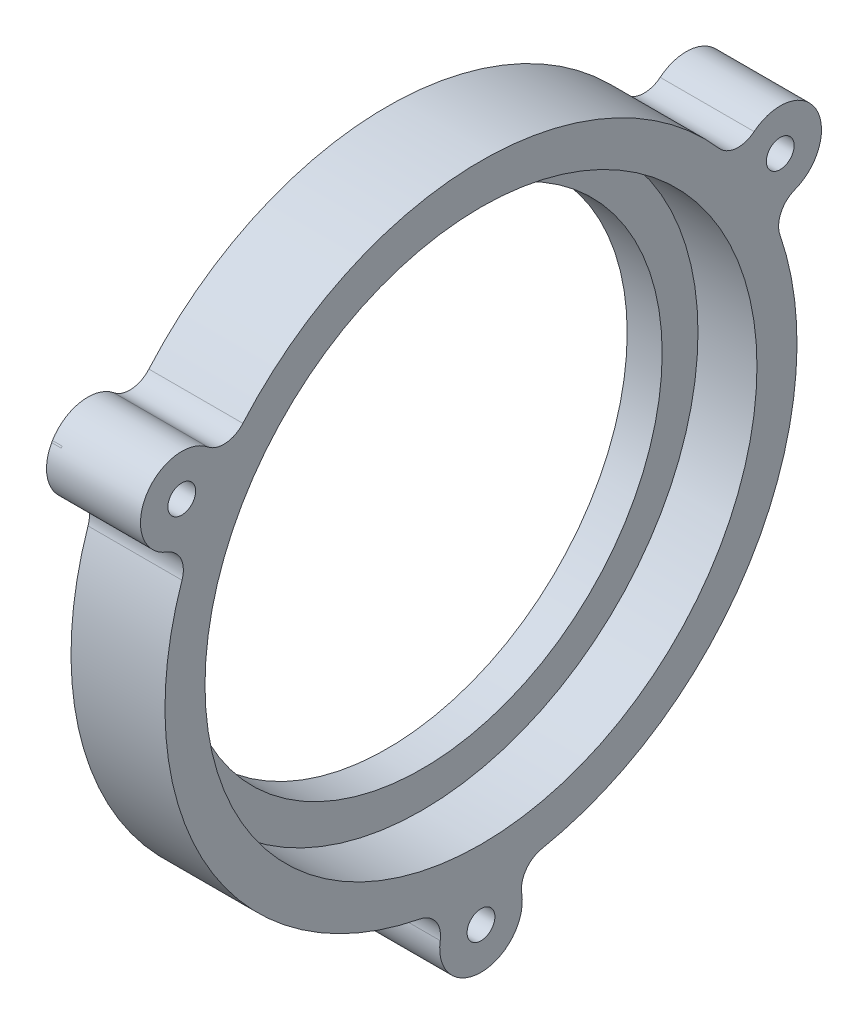
ISO-10303-21;
HEADER;
FILE_DESCRIPTION(('STEP AP214'),'2;1');
FILE_NAME('part.step','',(''),(''),'','','');
FILE_SCHEMA(('AUTOMOTIVE_DESIGN { 1 0 10303 214 1 1 1 1 }'));
ENDSEC;
DATA;
#1=APPLICATION_CONTEXT('core data for automotive mechanical design processes');
#2=APPLICATION_PROTOCOL_DEFINITION('international standard','automotive_design',2000,#1);
#3=PRODUCT_CONTEXT('',#1,'mechanical');
#4=PRODUCT('Part','Part','',(#3));
#5=PRODUCT_RELATED_PRODUCT_CATEGORY('part','',(#4));
#6=PRODUCT_DEFINITION_FORMATION('','',#4);
#7=PRODUCT_DEFINITION_CONTEXT('part definition',#1,'design');
#8=PRODUCT_DEFINITION('design','',#6,#7);
#9=PRODUCT_DEFINITION_SHAPE('','',#8);
#10=(LENGTH_UNIT() NAMED_UNIT(*) SI_UNIT(.MILLI.,.METRE.));
#11=(NAMED_UNIT(*) PLANE_ANGLE_UNIT() SI_UNIT($,.RADIAN.));
#12=(NAMED_UNIT(*) SI_UNIT($,.STERADIAN.) SOLID_ANGLE_UNIT());
#13=UNCERTAINTY_MEASURE_WITH_UNIT(LENGTH_MEASURE(1.E-05),#10,'distance_accuracy_value','');
#14=(GEOMETRIC_REPRESENTATION_CONTEXT(3) GLOBAL_UNCERTAINTY_ASSIGNED_CONTEXT((#13)) GLOBAL_UNIT_ASSIGNED_CONTEXT((#10,
#11,#12)) REPRESENTATION_CONTEXT('',''));
#15=CARTESIAN_POINT('',(0.,0.,0.));
#16=DIRECTION('',(0.,0.,1.));
#17=DIRECTION('',(1.,0.,0.));
#18=AXIS2_PLACEMENT_3D('',#15,#16,#17);
#19=CARTESIAN_POINT('',(-10.,0.,0.));
#20=DIRECTION('',(-1.,0.,0.));
#21=DIRECTION('',(0.,0.,1.));
#22=AXIS2_PLACEMENT_3D('',#19,#20,#21);
#23=CYLINDRICAL_SURFACE('',#22,37.5);
#24=DIRECTION('',(-1.,0.,0.));
#25=VECTOR('',#24,1.);
#26=CARTESIAN_POINT('',(-10.,24.6530272458357,-28.2573574068079));
#27=LINE('',#26,#25);
#28=CARTESIAN_POINT('',(37.,24.6530272458357,-28.2573574068079));
#29=VERTEX_POINT('',#28);
#30=CARTESIAN_POINT('',(25.85,24.6530272458357,-28.2573574068079));
#31=VERTEX_POINT('',#30);
#32=EDGE_CURVE('E327',#29,#31,#27,.T.);
#33=ORIENTED_EDGE('',*,*,#32,.T.);
#34=CARTESIAN_POINT('',(25.85,0.,0.));
#35=DIRECTION('',(-1.,0.,0.));
#36=DIRECTION('',(0.,0.,1.));
#37=AXIS2_PLACEMENT_3D('',#34,#35,#36);
#38=CIRCLE('',#37,37.5);
#39=CARTESIAN_POINT('',(25.85,24.6530272458361,28.2573574068076));
#40=VERTEX_POINT('',#39);
#41=EDGE_CURVE('E330',#40,#31,#38,.T.);
#42=ORIENTED_EDGE('',*,*,#41,.F.);
#43=DIRECTION('',(-1.,0.,0.));
#44=VECTOR('',#43,1.);
#45=CARTESIAN_POINT('',(-10.,24.6530272458361,28.2573574068076));
#46=LINE('',#45,#44);
#47=CARTESIAN_POINT('',(37.,24.6530272458361,28.2573574068076));
#48=VERTEX_POINT('',#47);
#49=EDGE_CURVE('E335',#40,#48,#46,.F.);
#50=ORIENTED_EDGE('',*,*,#49,.T.);
#51=CARTESIAN_POINT('',(37.,0.,0.));
#52=DIRECTION('',(1.,0.,0.));
#53=DIRECTION('',(0.,0.,-1.));
#54=AXIS2_PLACEMENT_3D('',#51,#52,#53);
#55=CIRCLE('',#54,37.5);
#56=EDGE_CURVE('E332',#29,#48,#55,.T.);
#57=ORIENTED_EDGE('',*,*,#56,.F.);
#58=EDGE_LOOP('',(#33,#42,#50,#57));
#59=FACE_BOUND('',#58,.T.);
#60=ADVANCED_FACE('F35',(#59),#23,.T.);
#61=DIRECTION('',(-1.,0.,0.));
#62=VECTOR('',#61,1.);
#63=CARTESIAN_POINT('',(-10.,12.145075735194,35.4788265784877));
#64=LINE('',#63,#62);
#65=CARTESIAN_POINT('',(37.,12.145075735194,35.4788265784876));
#66=VERTEX_POINT('',#65);
#67=CARTESIAN_POINT('',(25.85,12.145075735194,35.4788265784876));
#68=VERTEX_POINT('',#67);
#69=EDGE_CURVE('E505',#66,#68,#64,.T.);
#70=ORIENTED_EDGE('',*,*,#69,.T.);
#71=CARTESIAN_POINT('',(25.85,0.,0.));
#72=DIRECTION('',(-1.,0.,0.));
#73=DIRECTION('',(0.,0.,1.));
#74=AXIS2_PLACEMENT_3D('',#71,#72,#73);
#75=CIRCLE('',#74,37.5);
#76=CARTESIAN_POINT('',(25.85,-36.7981029810298,7.22146917168));
#77=VERTEX_POINT('',#76);
#78=EDGE_CURVE('E365',#77,#68,#75,.T.);
#79=ORIENTED_EDGE('',*,*,#78,.F.);
#80=DIRECTION('',(-1.,0.,0.));
#81=VECTOR('',#80,1.);
#82=CARTESIAN_POINT('',(-10.,-36.7981029810298,7.22146917168));
#83=LINE('',#82,#81);
#84=CARTESIAN_POINT('',(37.,-36.7981029810298,7.22146917168));
#85=VERTEX_POINT('',#84);
#86=EDGE_CURVE('E543',#77,#85,#83,.F.);
#87=ORIENTED_EDGE('',*,*,#86,.T.);
#88=EDGE_CURVE('E530',#66,#85,#55,.T.);
#89=ORIENTED_EDGE('',*,*,#88,.F.);
#90=EDGE_LOOP('',(#70,#79,#87,#89));
#91=FACE_BOUND('',#90,.T.);
#92=ADVANCED_FACE('F296',(#91),#23,.T.);
#93=CARTESIAN_POINT('',(27.,26.625269425503,30.5179459993522));
#94=DIRECTION('',(-1.,0.,0.));
#95=DIRECTION('',(0.,0.,1.));
#96=AXIS2_PLACEMENT_3D('',#93,#94,#95);
#97=CYLINDRICAL_SURFACE('',#96,3.);
#98=ORIENTED_EDGE('',*,*,#49,.F.);
#99=CARTESIAN_POINT('',(25.85,26.625269425503,30.5179459993522));
#100=DIRECTION('',(-1.,0.,0.));
#101=DIRECTION('',(0.,0.,1.));
#102=AXIS2_PLACEMENT_3D('',#99,#100,#101);
#103=CIRCLE('',#102,3.);
#104=CARTESIAN_POINT('',(25.85,24.2992177449323,32.4125392483939));
#105=VERTEX_POINT('',#104);
#106=EDGE_CURVE('E205',#105,#40,#103,.F.);
#107=ORIENTED_EDGE('',*,*,#106,.F.);
#108=DIRECTION('',(1.,0.,0.));
#109=VECTOR('',#108,1.);
#110=CARTESIAN_POINT('',(27.,24.2992177449323,32.4125392483938));
#111=LINE('',#110,#109);
#112=CARTESIAN_POINT('',(37.,24.2992177449323,32.4125392483938));
#113=VERTEX_POINT('',#112);
#114=EDGE_CURVE('E534',#113,#105,#111,.F.);
#115=ORIENTED_EDGE('',*,*,#114,.F.);
#116=CARTESIAN_POINT('',(37.,26.625269425503,30.5179459993522));
#117=DIRECTION('',(1.,0.,0.));
#118=DIRECTION('',(0.,0.,-1.));
#119=AXIS2_PLACEMENT_3D('',#116,#117,#118);
#120=CIRCLE('',#119,3.);
#121=EDGE_CURVE('E471',#48,#113,#120,.F.);
#122=ORIENTED_EDGE('',*,*,#121,.F.);
#123=EDGE_LOOP('',(#98,#107,#115,#122));
#124=FACE_BOUND('',#123,.T.);
#125=ADVANCED_FACE('F37',(#124),#97,.F.);
#126=CARTESIAN_POINT('',(-10.,26.6252694255026,-30.5179459993525));
#127=DIRECTION('',(-1.,0.,0.));
#128=DIRECTION('',(0.,0.,1.));
#129=AXIS2_PLACEMENT_3D('',#126,#127,#128);
#130=CYLINDRICAL_SURFACE('',#129,3.);
#131=DIRECTION('',(1.,0.,0.));
#132=VECTOR('',#131,1.);
#133=CARTESIAN_POINT('',(27.,24.2992177449318,-32.4125392483942));
#134=LINE('',#133,#132);
#135=CARTESIAN_POINT('',(25.85,24.2992177449318,-32.4125392483942));
#136=VERTEX_POINT('',#135);
#137=CARTESIAN_POINT('',(37.,24.2992177449318,-32.4125392483942));
#138=VERTEX_POINT('',#137);
#139=EDGE_CURVE('E344',#136,#138,#134,.T.);
#140=ORIENTED_EDGE('',*,*,#139,.F.);
#141=CARTESIAN_POINT('',(25.85,26.6252694255026,-30.5179459993525));
#142=DIRECTION('',(-1.,0.,0.));
#143=DIRECTION('',(0.,0.,1.));
#144=AXIS2_PLACEMENT_3D('',#141,#142,#143);
#145=CIRCLE('',#144,3.);
#146=EDGE_CURVE('E339',#31,#136,#145,.F.);
#147=ORIENTED_EDGE('',*,*,#146,.F.);
#148=ORIENTED_EDGE('',*,*,#32,.F.);
#149=CARTESIAN_POINT('',(37.,26.6252694255026,-30.5179459993525));
#150=DIRECTION('',(1.,0.,0.));
#151=DIRECTION('',(0.,0.,-1.));
#152=AXIS2_PLACEMENT_3D('',#149,#150,#151);
#153=CIRCLE('',#152,3.);
#154=EDGE_CURVE('E470',#138,#29,#153,.F.);
#155=ORIENTED_EDGE('',*,*,#154,.F.);
#156=EDGE_LOOP('',(#140,#147,#148,#155));
#157=FACE_BOUND('',#156,.T.);
#158=ADVANCED_FACE('F310',(#157),#130,.F.);
#159=CARTESIAN_POINT('',(27.,13.116681794009,-38.3171327047668));
#160=DIRECTION('',(-1.,0.,0.));
#161=DIRECTION('',(0.,0.,1.));
#162=AXIS2_PLACEMENT_3D('',#159,#160,#161);
#163=CYLINDRICAL_SURFACE('',#162,3.);
#164=DIRECTION('',(-1.,0.,0.));
#165=VECTOR('',#164,1.);
#166=CARTESIAN_POINT('',(-10.,12.1450757351935,-35.4788265784878));
#167=LINE('',#166,#165);
#168=CARTESIAN_POINT('',(25.85,12.1450757351935,-35.4788265784878));
#169=VERTEX_POINT('',#168);
#170=CARTESIAN_POINT('',(37.,12.1450757351935,-35.4788265784878));
#171=VERTEX_POINT('',#170);
#172=EDGE_CURVE('E334',#169,#171,#167,.F.);
#173=ORIENTED_EDGE('',*,*,#172,.F.);
#174=CARTESIAN_POINT('',(25.85,13.116681794009,-38.3171327047668));
#175=DIRECTION('',(-1.,0.,0.));
#176=DIRECTION('',(0.,0.,1.));
#177=AXIS2_PLACEMENT_3D('',#174,#175,#176);
#178=CIRCLE('',#177,3.);
#179=CARTESIAN_POINT('',(25.85,15.9204735178029,-37.250009483398));
#180=VERTEX_POINT('',#179);
#181=EDGE_CURVE('E351',#180,#169,#178,.F.);
#182=ORIENTED_EDGE('',*,*,#181,.F.);
#183=DIRECTION('',(1.,0.,0.));
#184=VECTOR('',#183,1.);
#185=CARTESIAN_POINT('',(27.,15.9204735178029,-37.250009483398));
#186=LINE('',#185,#184);
#187=CARTESIAN_POINT('',(37.,15.9204735178029,-37.250009483398));
#188=VERTEX_POINT('',#187);
#189=EDGE_CURVE('E455',#188,#180,#186,.F.);
#190=ORIENTED_EDGE('',*,*,#189,.F.);
#191=CARTESIAN_POINT('',(37.,13.116681794009,-38.3171327047668));
#192=DIRECTION('',(1.,0.,0.));
#193=DIRECTION('',(0.,0.,-1.));
#194=AXIS2_PLACEMENT_3D('',#191,#192,#193);
#195=CIRCLE('',#194,3.);
#196=EDGE_CURVE('E468',#171,#188,#195,.F.);
#197=ORIENTED_EDGE('',*,*,#196,.F.);
#198=EDGE_LOOP('',(#173,#182,#190,#197));
#199=FACE_BOUND('',#198,.T.);
#200=ADVANCED_FACE('F307',(#199),#163,.F.);
#201=CARTESIAN_POINT('',(-10.,-39.7419512195122,-7.79918670541442));
#202=DIRECTION('',(-1.,0.,0.));
#203=DIRECTION('',(0.,0.,1.));
#204=AXIS2_PLACEMENT_3D('',#201,#202,#203);
#205=CYLINDRICAL_SURFACE('',#204,3.);
#206=DIRECTION('',(1.,0.,0.));
#207=VECTOR('',#206,1.);
#208=CARTESIAN_POINT('',(27.,-40.2196912627354,-4.83747023500388));
#209=LINE('',#208,#207);
#210=CARTESIAN_POINT('',(25.85,-40.2196912627354,-4.83747023500388));
#211=VERTEX_POINT('',#210);
#212=CARTESIAN_POINT('',(37.,-40.2196912627354,-4.83747023500388));
#213=VERTEX_POINT('',#212);
#214=EDGE_CURVE('E501',#211,#213,#209,.T.);
#215=ORIENTED_EDGE('',*,*,#214,.F.);
#216=CARTESIAN_POINT('',(25.85,-39.7419512195122,-7.79918670541442));
#217=DIRECTION('',(-1.,0.,0.));
#218=DIRECTION('',(0.,0.,1.));
#219=AXIS2_PLACEMENT_3D('',#216,#217,#218);
#220=CIRCLE('',#219,3.);
#221=CARTESIAN_POINT('',(25.85,-36.7981029810298,-7.22146917168002));
#222=VERTEX_POINT('',#221);
#223=EDGE_CURVE('E358',#222,#211,#220,.F.);
#224=ORIENTED_EDGE('',*,*,#223,.F.);
#225=DIRECTION('',(-1.,0.,0.));
#226=VECTOR('',#225,1.);
#227=CARTESIAN_POINT('',(-10.,-36.7981029810298,-7.22146917168002));
#228=LINE('',#227,#226);
#229=CARTESIAN_POINT('',(37.,-36.7981029810298,-7.22146917168002));
#230=VERTEX_POINT('',#229);
#231=EDGE_CURVE('E541',#230,#222,#228,.T.);
#232=ORIENTED_EDGE('',*,*,#231,.F.);
#233=CARTESIAN_POINT('',(37.,-39.7419512195122,-7.79918670541442));
#234=DIRECTION('',(1.,0.,0.));
#235=DIRECTION('',(0.,0.,-1.));
#236=AXIS2_PLACEMENT_3D('',#233,#234,#235);
#237=CIRCLE('',#236,3.);
#238=EDGE_CURVE('E466',#213,#230,#237,.F.);
#239=ORIENTED_EDGE('',*,*,#238,.F.);
#240=EDGE_LOOP('',(#215,#224,#232,#239));
#241=FACE_BOUND('',#240,.T.);
#242=ADVANCED_FACE('F303',(#241),#205,.F.);
#243=CARTESIAN_POINT('',(27.,-39.7419512195122,7.7991867054144));
#244=DIRECTION('',(-1.,0.,0.));
#245=DIRECTION('',(0.,0.,1.));
#246=AXIS2_PLACEMENT_3D('',#243,#244,#245);
#247=CYLINDRICAL_SURFACE('',#246,3.);
#248=ORIENTED_EDGE('',*,*,#86,.F.);
#249=CARTESIAN_POINT('',(25.85,-39.7419512195122,7.7991867054144));
#250=DIRECTION('',(-1.,0.,0.));
#251=DIRECTION('',(0.,0.,1.));
#252=AXIS2_PLACEMENT_3D('',#249,#250,#251);
#253=CIRCLE('',#252,3.);
#254=CARTESIAN_POINT('',(25.85,-40.2196912627354,4.83747023500386));
#255=VERTEX_POINT('',#254);
#256=EDGE_CURVE('E362',#255,#77,#253,.F.);
#257=ORIENTED_EDGE('',*,*,#256,.F.);
#258=DIRECTION('',(1.,0.,0.));
#259=VECTOR('',#258,1.);
#260=CARTESIAN_POINT('',(27.,-40.2196912627354,4.83747023500387));
#261=LINE('',#260,#259);
#262=CARTESIAN_POINT('',(37.,-40.2196912627354,4.83747023500387));
#263=VERTEX_POINT('',#262);
#264=EDGE_CURVE('E461',#263,#255,#261,.F.);
#265=ORIENTED_EDGE('',*,*,#264,.F.);
#266=CARTESIAN_POINT('',(37.,-39.7419512195122,7.7991867054144));
#267=DIRECTION('',(1.,0.,0.));
#268=DIRECTION('',(0.,0.,-1.));
#269=AXIS2_PLACEMENT_3D('',#266,#267,#268);
#270=CIRCLE('',#269,3.);
#271=EDGE_CURVE('E459',#85,#263,#270,.F.);
#272=ORIENTED_EDGE('',*,*,#271,.F.);
#273=EDGE_LOOP('',(#248,#257,#265,#272));
#274=FACE_BOUND('',#273,.T.);
#275=ADVANCED_FACE('F299',(#274),#247,.F.);
#276=CARTESIAN_POINT('',(-10.,13.1166817940095,38.3171327047667));
#277=DIRECTION('',(-1.,0.,0.));
#278=DIRECTION('',(0.,0.,1.));
#279=AXIS2_PLACEMENT_3D('',#276,#277,#278);
#280=CYLINDRICAL_SURFACE('',#279,3.);
#281=DIRECTION('',(1.,0.,0.));
#282=VECTOR('',#281,1.);
#283=CARTESIAN_POINT('',(27.,15.9204735178034,37.2500094833978));
#284=LINE('',#283,#282);
#285=CARTESIAN_POINT('',(25.85,15.9204735178034,37.2500094833978));
#286=VERTEX_POINT('',#285);
#287=CARTESIAN_POINT('',(37.,15.9204735178034,37.2500094833978));
#288=VERTEX_POINT('',#287);
#289=EDGE_CURVE('E536',#286,#288,#284,.T.);
#290=ORIENTED_EDGE('',*,*,#289,.F.);
#291=CARTESIAN_POINT('',(25.85,13.1166817940095,38.3171327047667));
#292=DIRECTION('',(-1.,0.,0.));
#293=DIRECTION('',(0.,0.,1.));
#294=AXIS2_PLACEMENT_3D('',#291,#292,#293);
#295=CIRCLE('',#294,3.);
#296=EDGE_CURVE('E183',#68,#286,#295,.F.);
#297=ORIENTED_EDGE('',*,*,#296,.F.);
#298=ORIENTED_EDGE('',*,*,#69,.F.);
#299=CARTESIAN_POINT('',(37.,13.1166817940095,38.3171327047667));
#300=DIRECTION('',(1.,0.,0.));
#301=DIRECTION('',(0.,0.,-1.));
#302=AXIS2_PLACEMENT_3D('',#299,#300,#301);
#303=CIRCLE('',#302,3.);
#304=EDGE_CURVE('E457',#288,#66,#303,.F.);
#305=ORIENTED_EDGE('',*,*,#304,.F.);
#306=EDGE_LOOP('',(#290,#297,#298,#305));
#307=FACE_BOUND('',#306,.T.);
#308=ADVANCED_FACE('F237',(#307),#280,.F.);
#309=CARTESIAN_POINT('',(27.,20.4999999999997,-35.5070415551622));
#310=DIRECTION('',(1.,0.,0.));
#311=DIRECTION('',(0.,0.,-1.));
#312=AXIS2_PLACEMENT_3D('',#309,#310,#311);
#313=CYLINDRICAL_SURFACE('',#312,1.65);
#314=CARTESIAN_POINT('',(37.,20.4999999999997,-35.5070415551622));
#315=DIRECTION('',(1.,0.,0.));
#316=DIRECTION('',(0.,0.,-1.));
#317=AXIS2_PLACEMENT_3D('',#314,#315,#316);
#318=CIRCLE('',#317,1.65);
#319=CARTESIAN_POINT('',(37.,20.4999999999997,-37.1570415551622));
#320=VERTEX_POINT('',#319);
#321=EDGE_CURVE('E193',#320,#320,#318,.T.);
#322=ORIENTED_EDGE('',*,*,#321,.T.);
#323=EDGE_LOOP('',(#322));
#324=FACE_BOUND('',#323,.T.);
#325=CARTESIAN_POINT('',(25.85,20.4999999999997,-35.5070415551622));
#326=DIRECTION('',(-1.,0.,0.));
#327=DIRECTION('',(0.,0.,1.));
#328=AXIS2_PLACEMENT_3D('',#325,#326,#327);
#329=CIRCLE('',#328,1.65);
#330=CARTESIAN_POINT('',(25.85,20.4999999999997,-33.8570415551622));
#331=VERTEX_POINT('',#330);
#332=EDGE_CURVE('E372',#331,#331,#329,.F.);
#333=ORIENTED_EDGE('',*,*,#332,.F.);
#334=EDGE_LOOP('',(#333));
#335=FACE_BOUND('',#334,.T.);
#336=ADVANCED_FACE('F226',(#324,#335),#313,.F.);
#337=CARTESIAN_POINT('',(27.,20.4999999999997,-35.5070415551622));
#338=DIRECTION('',(1.,0.,0.));
#339=DIRECTION('',(0.,0.,-1.));
#340=AXIS2_PLACEMENT_3D('',#337,#338,#339);
#341=CYLINDRICAL_SURFACE('',#340,4.89999999999999);
#342=CARTESIAN_POINT('',(37.,20.4999999999997,-35.5070415551622));
#343=DIRECTION('',(1.,0.,0.));
#344=DIRECTION('',(0.,0.,-1.));
#345=AXIS2_PLACEMENT_3D('',#342,#343,#344);
#346=CIRCLE('',#345,4.89999999999999);
#347=EDGE_CURVE('E190',#138,#188,#346,.F.);
#348=ORIENTED_EDGE('',*,*,#347,.T.);
#349=ORIENTED_EDGE('',*,*,#189,.T.);
#350=CARTESIAN_POINT('',(25.85,20.4999999999997,-35.5070415551622));
#351=DIRECTION('',(-1.,0.,0.));
#352=DIRECTION('',(0.,0.,1.));
#353=AXIS2_PLACEMENT_3D('',#350,#351,#352);
#354=CIRCLE('',#353,4.89999999999999);
#355=CARTESIAN_POINT('',(25.85,22.8651054342066,-39.798460467956));
#356=VERTEX_POINT('',#355);
#357=EDGE_CURVE('E355',#356,#180,#354,.T.);
#358=ORIENTED_EDGE('',*,*,#357,.F.);
#359=DIRECTION('',(1.,0.,0.));
#360=VECTOR('',#359,1.);
#361=CARTESIAN_POINT('',(25.85,22.8651054342066,-39.798460467956));
#362=LINE('',#361,#360);
#363=CARTESIAN_POINT('',(27.,22.8651054342066,-39.798460467956));
#364=VERTEX_POINT('',#363);
#365=EDGE_CURVE('E427',#356,#364,#362,.T.);
#366=ORIENTED_EDGE('',*,*,#365,.T.);
#367=CARTESIAN_POINT('',(27.,23.0339250796566,-39.700992400211));
#368=DIRECTION('',(0.,-0.866025403784466,-0.499999999999952));
#369=VECTOR('',#368,1.);
#370=LINE('',#367,#369);
#371=CARTESIAN_POINT('',(27.,23.0339250796566,-39.700992400211));
#372=VERTEX_POINT('',#371);
#373=EDGE_CURVE('E11',#372,#364,#370,.T.);
#374=ORIENTED_EDGE('',*,*,#373,.F.);
#375=DIRECTION('',(1.,0.,0.));
#376=VECTOR('',#375,1.);
#377=CARTESIAN_POINT('',(25.85,23.0339250796566,-39.700992400211));
#378=LINE('',#377,#376);
#379=CARTESIAN_POINT('',(25.85,23.0339250796566,-39.700992400211));
#380=VERTEX_POINT('',#379);
#381=EDGE_CURVE('E195',#380,#372,#378,.T.);
#382=ORIENTED_EDGE('',*,*,#381,.F.);
#383=CARTESIAN_POINT('',(25.85,20.4999999999997,-35.5070415551622));
#384=DIRECTION('',(-1.,0.,0.));
#385=DIRECTION('',(0.,0.,1.));
#386=AXIS2_PLACEMENT_3D('',#383,#384,#385);
#387=CIRCLE('',#386,4.89999999999999);
#388=EDGE_CURVE('E345',#136,#380,#387,.T.);
#389=ORIENTED_EDGE('',*,*,#388,.F.);
#390=ORIENTED_EDGE('',*,*,#139,.T.);
#391=EDGE_LOOP('',(#348,#349,#358,#366,#374,#382,#389,#390));
#392=FACE_BOUND('',#391,.T.);
#393=ADVANCED_FACE('F236',(#392),#341,.T.);
#394=CARTESIAN_POINT('',(27.,-41.,0.));
#395=DIRECTION('',(1.,0.,0.));
#396=DIRECTION('',(0.,0.,-1.));
#397=AXIS2_PLACEMENT_3D('',#394,#395,#396);
#398=CYLINDRICAL_SURFACE('',#397,1.65);
#399=CARTESIAN_POINT('',(37.,-41.,0.));
#400=DIRECTION('',(1.,0.,0.));
#401=DIRECTION('',(0.,0.,-1.));
#402=AXIS2_PLACEMENT_3D('',#399,#400,#401);
#403=CIRCLE('',#402,1.65);
#404=CARTESIAN_POINT('',(37.,-41.,-1.65));
#405=VERTEX_POINT('',#404);
#406=EDGE_CURVE('E511',#405,#405,#403,.T.);
#407=ORIENTED_EDGE('',*,*,#406,.T.);
#408=EDGE_LOOP('',(#407));
#409=FACE_BOUND('',#408,.T.);
#410=CARTESIAN_POINT('',(25.85,-41.,0.));
#411=DIRECTION('',(-1.,0.,0.));
#412=DIRECTION('',(0.,0.,1.));
#413=AXIS2_PLACEMENT_3D('',#410,#411,#412);
#414=CIRCLE('',#413,1.65);
#415=CARTESIAN_POINT('',(25.85,-41.,1.64999999999999));
#416=VERTEX_POINT('',#415);
#417=EDGE_CURVE('E375',#416,#416,#414,.F.);
#418=ORIENTED_EDGE('',*,*,#417,.F.);
#419=EDGE_LOOP('',(#418));
#420=FACE_BOUND('',#419,.T.);
#421=ADVANCED_FACE('F242',(#409,#420),#398,.F.);
#422=CARTESIAN_POINT('',(27.,-41.,0.));
#423=DIRECTION('',(1.,0.,0.));
#424=DIRECTION('',(0.,0.,-1.));
#425=AXIS2_PLACEMENT_3D('',#422,#423,#424);
#426=CYLINDRICAL_SURFACE('',#425,4.89999999999999);
#427=CARTESIAN_POINT('',(37.,-41.,0.));
#428=DIRECTION('',(1.,0.,0.));
#429=DIRECTION('',(0.,0.,-1.));
#430=AXIS2_PLACEMENT_3D('',#427,#428,#429);
#431=CIRCLE('',#430,4.89999999999999);
#432=EDGE_CURVE('E503',#213,#263,#431,.F.);
#433=ORIENTED_EDGE('',*,*,#432,.T.);
#434=ORIENTED_EDGE('',*,*,#264,.T.);
#435=CARTESIAN_POINT('',(25.85,-41.,0.));
#436=DIRECTION('',(-1.,0.,0.));
#437=DIRECTION('',(0.,0.,1.));
#438=AXIS2_PLACEMENT_3D('',#435,#436,#437);
#439=CIRCLE('',#438,4.89999999999999);
#440=CARTESIAN_POINT('',(25.85,-45.8990305138639,0.0974680677450462));
#441=VERTEX_POINT('',#440);
#442=EDGE_CURVE('E366',#441,#255,#439,.T.);
#443=ORIENTED_EDGE('',*,*,#442,.F.);
#444=DIRECTION('',(1.,0.,0.));
#445=VECTOR('',#444,1.);
#446=CARTESIAN_POINT('',(25.85,-45.8990305138639,0.0974680677450462));
#447=LINE('',#446,#445);
#448=CARTESIAN_POINT('',(27.,-45.8990305138639,0.097468067745046));
#449=VERTEX_POINT('',#448);
#450=EDGE_CURVE('E381',#441,#449,#447,.T.);
#451=ORIENTED_EDGE('',*,*,#450,.T.);
#452=CARTESIAN_POINT('',(27.,-45.8990305138639,-0.0974680677450223));
#453=DIRECTION('',(0.,0.,1.));
#454=VECTOR('',#453,1.);
#455=LINE('',#452,#454);
#456=CARTESIAN_POINT('',(27.,-45.8990305138639,-0.0974680677450572));
#457=VERTEX_POINT('',#456);
#458=EDGE_CURVE('E46',#457,#449,#455,.T.);
#459=ORIENTED_EDGE('',*,*,#458,.F.);
#460=DIRECTION('',(1.,0.,0.));
#461=VECTOR('',#460,1.);
#462=CARTESIAN_POINT('',(25.85,-45.8990305138639,-0.0974680677450223));
#463=LINE('',#462,#461);
#464=CARTESIAN_POINT('',(25.85,-45.8990305138639,-0.0974680677450223));
#465=VERTEX_POINT('',#464);
#466=EDGE_CURVE('E431',#465,#457,#463,.T.);
#467=ORIENTED_EDGE('',*,*,#466,.F.);
#468=CARTESIAN_POINT('',(25.85,-41.,0.));
#469=DIRECTION('',(-1.,0.,0.));
#470=DIRECTION('',(0.,0.,1.));
#471=AXIS2_PLACEMENT_3D('',#468,#469,#470);
#472=CIRCLE('',#471,4.89999999999999);
#473=EDGE_CURVE('E361',#211,#465,#472,.T.);
#474=ORIENTED_EDGE('',*,*,#473,.F.);
#475=ORIENTED_EDGE('',*,*,#214,.T.);
#476=EDGE_LOOP('',(#433,#434,#443,#451,#459,#467,#474,#475));
#477=FACE_BOUND('',#476,.T.);
#478=ADVANCED_FACE('F245',(#477),#426,.T.);
#479=CARTESIAN_POINT('',(27.,20.5000000000002,35.5070415551619));
#480=DIRECTION('',(1.,0.,0.));
#481=DIRECTION('',(0.,0.,-1.));
#482=AXIS2_PLACEMENT_3D('',#479,#480,#481);
#483=CYLINDRICAL_SURFACE('',#482,1.65);
#484=CARTESIAN_POINT('',(37.,20.5000000000002,35.5070415551619));
#485=DIRECTION('',(1.,0.,0.));
#486=DIRECTION('',(0.,0.,-1.));
#487=AXIS2_PLACEMENT_3D('',#484,#485,#486);
#488=CIRCLE('',#487,1.65);
#489=CARTESIAN_POINT('',(37.,20.5000000000002,33.8570415551619));
#490=VERTEX_POINT('',#489);
#491=EDGE_CURVE('E519',#490,#490,#488,.T.);
#492=ORIENTED_EDGE('',*,*,#491,.T.);
#493=EDGE_LOOP('',(#492));
#494=FACE_BOUND('',#493,.T.);
#495=CARTESIAN_POINT('',(25.85,20.5000000000002,35.5070415551619));
#496=DIRECTION('',(-1.,0.,0.));
#497=DIRECTION('',(0.,0.,1.));
#498=AXIS2_PLACEMENT_3D('',#495,#496,#497);
#499=CIRCLE('',#498,1.65);
#500=CARTESIAN_POINT('',(25.85,20.5000000000002,37.1570415551619));
#501=VERTEX_POINT('',#500);
#502=EDGE_CURVE('E378',#501,#501,#499,.F.);
#503=ORIENTED_EDGE('',*,*,#502,.F.);
#504=EDGE_LOOP('',(#503));
#505=FACE_BOUND('',#504,.T.);
#506=ADVANCED_FACE('F250',(#494,#505),#483,.F.);
#507=CARTESIAN_POINT('',(27.,20.5000000000002,35.5070415551619));
#508=DIRECTION('',(1.,0.,0.));
#509=DIRECTION('',(0.,0.,-1.));
#510=AXIS2_PLACEMENT_3D('',#507,#508,#509);
#511=CYLINDRICAL_SURFACE('',#510,4.89999999999999);
#512=CARTESIAN_POINT('',(27.,22.8651054342071,39.7984604679557));
#513=DIRECTION('',(0.,0.866025403784418,-0.500000000000037));
#514=VECTOR('',#513,1.);
#515=LINE('',#512,#514);
#516=CARTESIAN_POINT('',(27.,22.8651054342072,39.7984604679557));
#517=VERTEX_POINT('',#516);
#518=CARTESIAN_POINT('',(27.,23.0339250796571,39.7009924002107));
#519=VERTEX_POINT('',#518);
#520=EDGE_CURVE('E188',#517,#519,#515,.T.);
#521=ORIENTED_EDGE('',*,*,#520,.F.);
#522=DIRECTION('',(1.,0.,0.));
#523=VECTOR('',#522,1.);
#524=CARTESIAN_POINT('',(25.85,22.8651054342072,39.7984604679557));
#525=LINE('',#524,#523);
#526=CARTESIAN_POINT('',(25.85,22.8651054342072,39.7984604679557));
#527=VERTEX_POINT('',#526);
#528=EDGE_CURVE('E166',#527,#517,#525,.T.);
#529=ORIENTED_EDGE('',*,*,#528,.F.);
#530=CARTESIAN_POINT('',(25.85,20.5000000000002,35.5070415551619));
#531=DIRECTION('',(-1.,0.,0.));
#532=DIRECTION('',(0.,0.,1.));
#533=AXIS2_PLACEMENT_3D('',#530,#531,#532);
#534=CIRCLE('',#533,4.89999999999999);
#535=EDGE_CURVE('E174',#286,#527,#534,.T.);
#536=ORIENTED_EDGE('',*,*,#535,.F.);
#537=ORIENTED_EDGE('',*,*,#289,.T.);
#538=CARTESIAN_POINT('',(37.,20.5000000000002,35.5070415551619));
#539=DIRECTION('',(1.,0.,0.));
#540=DIRECTION('',(0.,0.,-1.));
#541=AXIS2_PLACEMENT_3D('',#538,#539,#540);
#542=CIRCLE('',#541,4.89999999999999);
#543=EDGE_CURVE('E514',#288,#113,#542,.F.);
#544=ORIENTED_EDGE('',*,*,#543,.T.);
#545=ORIENTED_EDGE('',*,*,#114,.T.);
#546=CARTESIAN_POINT('',(25.85,20.5000000000002,35.5070415551619));
#547=DIRECTION('',(-1.,0.,0.));
#548=DIRECTION('',(0.,0.,1.));
#549=AXIS2_PLACEMENT_3D('',#546,#547,#548);
#550=CIRCLE('',#549,4.89999999999999);
#551=CARTESIAN_POINT('',(25.85,23.0339250796571,39.7009924002107));
#552=VERTEX_POINT('',#551);
#553=EDGE_CURVE('E173',#552,#105,#550,.T.);
#554=ORIENTED_EDGE('',*,*,#553,.F.);
#555=DIRECTION('',(1.,0.,0.));
#556=VECTOR('',#555,1.);
#557=CARTESIAN_POINT('',(25.85,23.0339250796571,39.7009924002107));
#558=LINE('',#557,#556);
#559=EDGE_CURVE('E168',#552,#519,#558,.T.);
#560=ORIENTED_EDGE('',*,*,#559,.T.);
#561=EDGE_LOOP('',(#521,#529,#536,#537,#544,#545,#554,#560));
#562=FACE_BOUND('',#561,.T.);
#563=ADVANCED_FACE('F187',(#562),#511,.T.);
#564=CARTESIAN_POINT('',(37.,0.,0.));
#565=DIRECTION('',(-1.,0.,0.));
#566=DIRECTION('',(0.,0.,1.));
#567=AXIS2_PLACEMENT_3D('',#564,#565,#566);
#568=CYLINDRICAL_SURFACE('',#567,32.75);
#569=CARTESIAN_POINT('',(37.,0.,0.));
#570=DIRECTION('',(1.,0.,0.));
#571=DIRECTION('',(0.,0.,-1.));
#572=AXIS2_PLACEMENT_3D('',#569,#570,#571);
#573=CIRCLE('',#572,32.75);
#574=CARTESIAN_POINT('',(37.,0.,-32.75));
#575=VERTEX_POINT('',#574);
#576=EDGE_CURVE('E523',#575,#575,#573,.T.);
#577=ORIENTED_EDGE('',*,*,#576,.T.);
#578=EDGE_LOOP('',(#577));
#579=FACE_BOUND('',#578,.T.);
#580=CARTESIAN_POINT('',(30.,0.,0.));
#581=DIRECTION('',(1.,0.,0.));
#582=DIRECTION('',(0.,0.,-1.));
#583=AXIS2_PLACEMENT_3D('',#580,#581,#582);
#584=CIRCLE('',#583,32.75);
#585=CARTESIAN_POINT('',(30.,0.,-32.75));
#586=VERTEX_POINT('',#585);
#587=EDGE_CURVE('E522',#586,#586,#584,.T.);
#588=ORIENTED_EDGE('',*,*,#587,.F.);
#589=EDGE_LOOP('',(#588));
#590=FACE_BOUND('',#589,.T.);
#591=ADVANCED_FACE('F277',(#579,#590),#568,.F.);
#592=CARTESIAN_POINT('',(37.,0.,0.));
#593=DIRECTION('',(1.,0.,0.));
#594=DIRECTION('',(0.,0.,-1.));
#595=AXIS2_PLACEMENT_3D('',#592,#593,#594);
#596=PLANE('',#595);
#597=ORIENTED_EDGE('',*,*,#543,.F.);
#598=ORIENTED_EDGE('',*,*,#304,.T.);
#599=ORIENTED_EDGE('',*,*,#88,.T.);
#600=ORIENTED_EDGE('',*,*,#271,.T.);
#601=ORIENTED_EDGE('',*,*,#432,.F.);
#602=ORIENTED_EDGE('',*,*,#238,.T.);
#603=EDGE_CURVE('E529',#230,#171,#55,.T.);
#604=ORIENTED_EDGE('',*,*,#603,.T.);
#605=ORIENTED_EDGE('',*,*,#196,.T.);
#606=ORIENTED_EDGE('',*,*,#347,.F.);
#607=ORIENTED_EDGE('',*,*,#154,.T.);
#608=ORIENTED_EDGE('',*,*,#56,.T.);
#609=ORIENTED_EDGE('',*,*,#121,.T.);
#610=EDGE_LOOP('',(#597,#598,#599,#600,#601,#602,#604,#605,#606,#607,#608,#609));
#611=FACE_BOUND('',#610,.T.);
#612=ORIENTED_EDGE('',*,*,#576,.F.);
#613=EDGE_LOOP('',(#612));
#614=FACE_BOUND('',#613,.T.);
#615=ORIENTED_EDGE('',*,*,#491,.F.);
#616=EDGE_LOOP('',(#615));
#617=FACE_BOUND('',#616,.T.);
#618=ORIENTED_EDGE('',*,*,#406,.F.);
#619=EDGE_LOOP('',(#618));
#620=FACE_BOUND('',#619,.T.);
#621=ORIENTED_EDGE('',*,*,#321,.F.);
#622=EDGE_LOOP('',(#621));
#623=FACE_BOUND('',#622,.T.);
#624=ADVANCED_FACE('F280',(#611,#614,#617,#620,#623),#596,.T.);
#625=CARTESIAN_POINT('',(30.,0.,0.));
#626=DIRECTION('',(-1.,0.,0.));
#627=DIRECTION('',(0.,0.,1.));
#628=AXIS2_PLACEMENT_3D('',#625,#626,#627);
#629=CYLINDRICAL_SURFACE('',#628,28.5);
#630=CARTESIAN_POINT('',(30.,0.,0.));
#631=DIRECTION('',(1.,0.,0.));
#632=DIRECTION('',(0.,0.,-1.));
#633=AXIS2_PLACEMENT_3D('',#630,#631,#632);
#634=CIRCLE('',#633,28.5);
#635=CARTESIAN_POINT('',(30.,0.,-28.5));
#636=VERTEX_POINT('',#635);
#637=EDGE_CURVE('E531',#636,#636,#634,.T.);
#638=ORIENTED_EDGE('',*,*,#637,.T.);
#639=EDGE_LOOP('',(#638));
#640=FACE_BOUND('',#639,.T.);
#641=CARTESIAN_POINT('',(25.85,0.,0.));
#642=DIRECTION('',(-1.,0.,0.));
#643=DIRECTION('',(0.,0.,1.));
#644=AXIS2_PLACEMENT_3D('',#641,#642,#643);
#645=CIRCLE('',#644,28.5);
#646=CARTESIAN_POINT('',(25.85,0.,28.5));
#647=VERTEX_POINT('',#646);
#648=EDGE_CURVE('E369',#647,#647,#645,.F.);
#649=ORIENTED_EDGE('',*,*,#648,.F.);
#650=EDGE_LOOP('',(#649));
#651=FACE_BOUND('',#650,.T.);
#652=ADVANCED_FACE('F284',(#640,#651),#629,.F.);
#653=CARTESIAN_POINT('',(30.,0.,0.));
#654=DIRECTION('',(1.,0.,0.));
#655=DIRECTION('',(0.,0.,-1.));
#656=AXIS2_PLACEMENT_3D('',#653,#654,#655);
#657=PLANE('',#656);
#658=ORIENTED_EDGE('',*,*,#637,.F.);
#659=EDGE_LOOP('',(#658));
#660=FACE_BOUND('',#659,.T.);
#661=ORIENTED_EDGE('',*,*,#587,.T.);
#662=EDGE_LOOP('',(#661));
#663=FACE_BOUND('',#662,.T.);
#664=ADVANCED_FACE('F288',(#660,#663),#657,.T.);
#665=ORIENTED_EDGE('',*,*,#231,.T.);
#666=CARTESIAN_POINT('',(25.85,0.,0.));
#667=DIRECTION('',(-1.,0.,0.));
#668=DIRECTION('',(0.,0.,1.));
#669=AXIS2_PLACEMENT_3D('',#666,#667,#668);
#670=CIRCLE('',#669,37.5);
#671=EDGE_CURVE('E354',#169,#222,#670,.T.);
#672=ORIENTED_EDGE('',*,*,#671,.F.);
#673=ORIENTED_EDGE('',*,*,#172,.T.);
#674=ORIENTED_EDGE('',*,*,#603,.F.);
#675=EDGE_LOOP('',(#665,#672,#673,#674));
#676=FACE_BOUND('',#675,.T.);
#677=ADVANCED_FACE('F223',(#676),#23,.T.);
#678=CARTESIAN_POINT('',(25.85,22.9495152569329,39.7497264340827));
#679=DIRECTION('',(0.,-0.500000000000021,-0.866025403784426));
#680=DIRECTION('',(0.,0.866025403784427,-0.500000000000021));
#681=AXIS2_PLACEMENT_3D('',#678,#679,#680);
#682=PLANE('',#681);
#683=ORIENTED_EDGE('',*,*,#520,.T.);
#684=ORIENTED_EDGE('',*,*,#559,.F.);
#685=CARTESIAN_POINT('',(25.85,22.8651054342071,39.7984604679557));
#686=DIRECTION('',(0.,0.866025403784418,-0.500000000000037));
#687=VECTOR('',#686,1.);
#688=LINE('',#685,#687);
#689=EDGE_CURVE('E161',#527,#552,#688,.T.);
#690=ORIENTED_EDGE('',*,*,#689,.F.);
#691=ORIENTED_EDGE('',*,*,#528,.T.);
#692=EDGE_LOOP('',(#683,#684,#690,#691));
#693=FACE_BOUND('',#692,.T.);
#694=ADVANCED_FACE('F164',(#693),#682,.F.);
#695=CARTESIAN_POINT('',(25.85,22.9495152569301,-39.7497264340843));
#696=DIRECTION('',(0.,-0.49999999999996,0.866025403784462));
#697=DIRECTION('',(0.,-0.866025403784462,-0.49999999999996));
#698=AXIS2_PLACEMENT_3D('',#695,#696,#697);
#699=PLANE('',#698);
#700=ORIENTED_EDGE('',*,*,#373,.T.);
#701=ORIENTED_EDGE('',*,*,#365,.F.);
#702=CARTESIAN_POINT('',(25.85,23.0339250796566,-39.700992400211));
#703=DIRECTION('',(0.,-0.866025403784466,-0.499999999999952));
#704=VECTOR('',#703,1.);
#705=LINE('',#702,#704);
#706=EDGE_CURVE('E347',#380,#356,#705,.T.);
#707=ORIENTED_EDGE('',*,*,#706,.F.);
#708=ORIENTED_EDGE('',*,*,#381,.T.);
#709=EDGE_LOOP('',(#700,#701,#707,#708));
#710=FACE_BOUND('',#709,.T.);
#711=ADVANCED_FACE('F222',(#710),#699,.F.);
#712=CARTESIAN_POINT('',(25.85,-45.8990305138639,0.));
#713=DIRECTION('',(0.,1.,0.));
#714=DIRECTION('',(0.,0.,1.));
#715=AXIS2_PLACEMENT_3D('',#712,#713,#714);
#716=PLANE('',#715);
#717=ORIENTED_EDGE('',*,*,#458,.T.);
#718=ORIENTED_EDGE('',*,*,#450,.F.);
#719=CARTESIAN_POINT('',(25.85,-45.8990305138639,-0.0974680677450223));
#720=DIRECTION('',(0.,0.,1.));
#721=VECTOR('',#720,1.);
#722=LINE('',#719,#721);
#723=EDGE_CURVE('E385',#465,#441,#722,.T.);
#724=ORIENTED_EDGE('',*,*,#723,.F.);
#725=ORIENTED_EDGE('',*,*,#466,.T.);
#726=EDGE_LOOP('',(#717,#718,#724,#725));
#727=FACE_BOUND('',#726,.T.);
#728=ADVANCED_FACE('F399',(#727),#716,.F.);
#729=CARTESIAN_POINT('',(25.85,0.,0.));
#730=DIRECTION('',(-1.,0.,0.));
#731=DIRECTION('',(0.,0.,1.));
#732=AXIS2_PLACEMENT_3D('',#729,#730,#731);
#733=PLANE('',#732);
#734=ORIENTED_EDGE('',*,*,#535,.T.);
#735=ORIENTED_EDGE('',*,*,#689,.T.);
#736=ORIENTED_EDGE('',*,*,#553,.T.);
#737=ORIENTED_EDGE('',*,*,#106,.T.);
#738=ORIENTED_EDGE('',*,*,#41,.T.);
#739=ORIENTED_EDGE('',*,*,#146,.T.);
#740=ORIENTED_EDGE('',*,*,#388,.T.);
#741=ORIENTED_EDGE('',*,*,#706,.T.);
#742=ORIENTED_EDGE('',*,*,#357,.T.);
#743=ORIENTED_EDGE('',*,*,#181,.T.);
#744=ORIENTED_EDGE('',*,*,#671,.T.);
#745=ORIENTED_EDGE('',*,*,#223,.T.);
#746=ORIENTED_EDGE('',*,*,#473,.T.);
#747=ORIENTED_EDGE('',*,*,#723,.T.);
#748=ORIENTED_EDGE('',*,*,#442,.T.);
#749=ORIENTED_EDGE('',*,*,#256,.T.);
#750=ORIENTED_EDGE('',*,*,#78,.T.);
#751=ORIENTED_EDGE('',*,*,#296,.T.);
#752=EDGE_LOOP('',(#734,#735,#736,#737,#738,#739,#740,#741,#742,#743,#744,#745,#746,#747,#748,
#749,#750,#751));
#753=FACE_BOUND('',#752,.T.);
#754=ORIENTED_EDGE('',*,*,#648,.T.);
#755=EDGE_LOOP('',(#754));
#756=FACE_BOUND('',#755,.T.);
#757=ORIENTED_EDGE('',*,*,#332,.T.);
#758=EDGE_LOOP('',(#757));
#759=FACE_BOUND('',#758,.T.);
#760=ORIENTED_EDGE('',*,*,#417,.T.);
#761=EDGE_LOOP('',(#760));
#762=FACE_BOUND('',#761,.T.);
#763=ORIENTED_EDGE('',*,*,#502,.T.);
#764=EDGE_LOOP('',(#763));
#765=FACE_BOUND('',#764,.T.);
#766=ADVANCED_FACE('F179',(#753,#756,#759,#762,#765),#733,.T.);
#767=CLOSED_SHELL('',(#60,#92,#125,#158,#200,#242,#275,#308,#336,#393,#421,#478,#506,#563,#591,
#624,#652,#664,#677,#694,#711,#728,#766));
#768=MANIFOLD_SOLID_BREP('B2',#767);
#769=ADVANCED_BREP_SHAPE_REPRESENTATION('',(#18,#768),#14);
#770=SHAPE_DEFINITION_REPRESENTATION(#9,#769);
ENDSEC;
END-ISO-10303-21;
